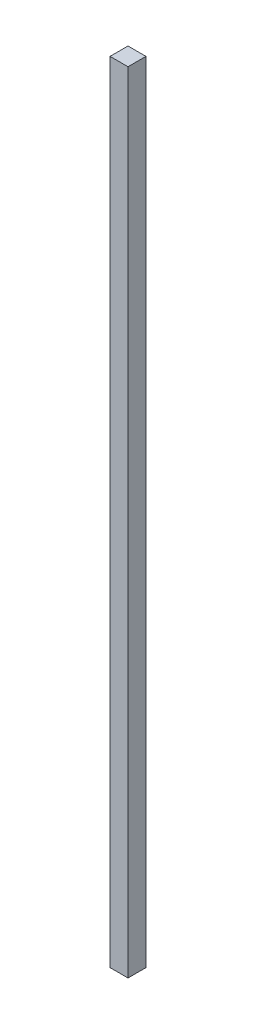
ISO-10303-21;
HEADER;
FILE_DESCRIPTION(('STEP AP214'),'2;1');
FILE_NAME('part.step','',(''),(''),'','','');
FILE_SCHEMA(('AUTOMOTIVE_DESIGN { 1 0 10303 214 1 1 1 1 }'));
ENDSEC;
DATA;
#1=APPLICATION_CONTEXT('core data for automotive mechanical design processes');
#2=APPLICATION_PROTOCOL_DEFINITION('international standard','automotive_design',2000,#1);
#3=PRODUCT_CONTEXT('',#1,'mechanical');
#4=PRODUCT('Part','Part','',(#3));
#5=PRODUCT_RELATED_PRODUCT_CATEGORY('part','',(#4));
#6=PRODUCT_DEFINITION_FORMATION('','',#4);
#7=PRODUCT_DEFINITION_CONTEXT('part definition',#1,'design');
#8=PRODUCT_DEFINITION('design','',#6,#7);
#9=PRODUCT_DEFINITION_SHAPE('','',#8);
#10=(LENGTH_UNIT() NAMED_UNIT(*) SI_UNIT(.MILLI.,.METRE.));
#11=(NAMED_UNIT(*) PLANE_ANGLE_UNIT() SI_UNIT($,.RADIAN.));
#12=(NAMED_UNIT(*) SI_UNIT($,.STERADIAN.) SOLID_ANGLE_UNIT());
#13=UNCERTAINTY_MEASURE_WITH_UNIT(LENGTH_MEASURE(1.E-05),#10,'distance_accuracy_value','');
#14=(GEOMETRIC_REPRESENTATION_CONTEXT(3) GLOBAL_UNCERTAINTY_ASSIGNED_CONTEXT((#13)) GLOBAL_UNIT_ASSIGNED_CONTEXT((#10,
#11,#12)) REPRESENTATION_CONTEXT('',''));
#15=CARTESIAN_POINT('',(0.,0.,0.));
#16=DIRECTION('',(0.,0.,1.));
#17=DIRECTION('',(1.,0.,0.));
#18=AXIS2_PLACEMENT_3D('',#15,#16,#17);
#19=CARTESIAN_POINT('',(0.,279.4,0.));
#20=DIRECTION('',(1.,0.,0.));
#21=DIRECTION('',(0.,0.,-1.));
#22=AXIS2_PLACEMENT_3D('',#19,#20,#21);
#23=PLANE('',#22);
#24=DIRECTION('',(0.,0.,1.));
#25=VECTOR('',#24,1.);
#26=CARTESIAN_POINT('',(0.,0.,0.));
#27=LINE('',#26,#25);
#28=CARTESIAN_POINT('',(0.,0.,0.));
#29=VERTEX_POINT('',#28);
#30=CARTESIAN_POINT('',(0.,0.,6.35));
#31=VERTEX_POINT('',#30);
#32=EDGE_CURVE('E96',#29,#31,#27,.T.);
#33=ORIENTED_EDGE('',*,*,#32,.T.);
#34=DIRECTION('',(0.,-1.,0.));
#35=VECTOR('',#34,1.);
#36=CARTESIAN_POINT('',(0.,279.4,6.35));
#37=LINE('',#36,#35);
#38=CARTESIAN_POINT('',(0.,279.4,6.35));
#39=VERTEX_POINT('',#38);
#40=EDGE_CURVE('E11',#39,#31,#37,.T.);
#41=ORIENTED_EDGE('',*,*,#40,.F.);
#42=DIRECTION('',(0.,0.,1.));
#43=VECTOR('',#42,1.);
#44=CARTESIAN_POINT('',(0.,279.4,0.));
#45=LINE('',#44,#43);
#46=CARTESIAN_POINT('',(0.,279.4,0.));
#47=VERTEX_POINT('',#46);
#48=EDGE_CURVE('E84',#47,#39,#45,.T.);
#49=ORIENTED_EDGE('',*,*,#48,.F.);
#50=DIRECTION('',(0.,-1.,0.));
#51=VECTOR('',#50,1.);
#52=CARTESIAN_POINT('',(0.,279.4,0.));
#53=LINE('',#52,#51);
#54=EDGE_CURVE('E92',#47,#29,#53,.T.);
#55=ORIENTED_EDGE('',*,*,#54,.T.);
#56=EDGE_LOOP('',(#33,#41,#49,#55));
#57=FACE_BOUND('',#56,.T.);
#58=ADVANCED_FACE('F33',(#57),#23,.F.);
#59=CARTESIAN_POINT('',(0.,279.4,6.35));
#60=DIRECTION('',(0.,0.,-1.));
#61=DIRECTION('',(-1.,0.,0.));
#62=AXIS2_PLACEMENT_3D('',#59,#60,#61);
#63=PLANE('',#62);
#64=DIRECTION('',(1.,0.,0.));
#65=VECTOR('',#64,1.);
#66=CARTESIAN_POINT('',(0.,0.,6.35));
#67=LINE('',#66,#65);
#68=CARTESIAN_POINT('',(6.35,0.,6.35));
#69=VERTEX_POINT('',#68);
#70=EDGE_CURVE('E88',#31,#69,#67,.T.);
#71=ORIENTED_EDGE('',*,*,#70,.T.);
#72=DIRECTION('',(0.,-1.,0.));
#73=VECTOR('',#72,1.);
#74=CARTESIAN_POINT('',(6.35,279.4,6.35));
#75=LINE('',#74,#73);
#76=CARTESIAN_POINT('',(6.35,279.4,6.35));
#77=VERTEX_POINT('',#76);
#78=EDGE_CURVE('E41',#77,#69,#75,.T.);
#79=ORIENTED_EDGE('',*,*,#78,.F.);
#80=DIRECTION('',(1.,0.,0.));
#81=VECTOR('',#80,1.);
#82=CARTESIAN_POINT('',(0.,279.4,6.35));
#83=LINE('',#82,#81);
#84=EDGE_CURVE('E79',#39,#77,#83,.T.);
#85=ORIENTED_EDGE('',*,*,#84,.F.);
#86=ORIENTED_EDGE('',*,*,#40,.T.);
#87=EDGE_LOOP('',(#71,#79,#85,#86));
#88=FACE_BOUND('',#87,.T.);
#89=ADVANCED_FACE('F87',(#88),#63,.F.);
#90=CARTESIAN_POINT('',(6.35,279.4,0.));
#91=DIRECTION('',(-1.,0.,0.));
#92=DIRECTION('',(0.,0.,1.));
#93=AXIS2_PLACEMENT_3D('',#90,#91,#92);
#94=PLANE('',#93);
#95=DIRECTION('',(0.,0.,-1.));
#96=VECTOR('',#95,1.);
#97=CARTESIAN_POINT('',(6.35,0.,0.));
#98=LINE('',#97,#96);
#99=CARTESIAN_POINT('',(6.35,0.,0.));
#100=VERTEX_POINT('',#99);
#101=EDGE_CURVE('E66',#69,#100,#98,.T.);
#102=ORIENTED_EDGE('',*,*,#101,.T.);
#103=DIRECTION('',(0.,-1.,0.));
#104=VECTOR('',#103,1.);
#105=CARTESIAN_POINT('',(6.35,279.4,0.));
#106=LINE('',#105,#104);
#107=CARTESIAN_POINT('',(6.35,279.4,0.));
#108=VERTEX_POINT('',#107);
#109=EDGE_CURVE('E89',#108,#100,#106,.T.);
#110=ORIENTED_EDGE('',*,*,#109,.F.);
#111=DIRECTION('',(0.,0.,-1.));
#112=VECTOR('',#111,1.);
#113=CARTESIAN_POINT('',(6.35,279.4,0.));
#114=LINE('',#113,#112);
#115=EDGE_CURVE('E82',#77,#108,#114,.T.);
#116=ORIENTED_EDGE('',*,*,#115,.F.);
#117=ORIENTED_EDGE('',*,*,#78,.T.);
#118=EDGE_LOOP('',(#102,#110,#116,#117));
#119=FACE_BOUND('',#118,.T.);
#120=ADVANCED_FACE('F90',(#119),#94,.F.);
#121=CARTESIAN_POINT('',(0.,279.4,0.));
#122=DIRECTION('',(0.,0.,1.));
#123=DIRECTION('',(1.,0.,0.));
#124=AXIS2_PLACEMENT_3D('',#121,#122,#123);
#125=PLANE('',#124);
#126=DIRECTION('',(-1.,0.,0.));
#127=VECTOR('',#126,1.);
#128=CARTESIAN_POINT('',(0.,0.,0.));
#129=LINE('',#128,#127);
#130=EDGE_CURVE('E72',#100,#29,#129,.T.);
#131=ORIENTED_EDGE('',*,*,#130,.T.);
#132=ORIENTED_EDGE('',*,*,#54,.F.);
#133=DIRECTION('',(-1.,0.,0.));
#134=VECTOR('',#133,1.);
#135=CARTESIAN_POINT('',(0.,279.4,0.));
#136=LINE('',#135,#134);
#137=EDGE_CURVE('E49',#108,#47,#136,.T.);
#138=ORIENTED_EDGE('',*,*,#137,.F.);
#139=ORIENTED_EDGE('',*,*,#109,.T.);
#140=EDGE_LOOP('',(#131,#132,#138,#139));
#141=FACE_BOUND('',#140,.T.);
#142=ADVANCED_FACE('F103',(#141),#125,.F.);
#143=CARTESIAN_POINT('',(0.,279.4,0.));
#144=DIRECTION('',(0.,1.,0.));
#145=DIRECTION('',(0.,0.,1.));
#146=AXIS2_PLACEMENT_3D('',#143,#144,#145);
#147=PLANE('',#146);
#148=ORIENTED_EDGE('',*,*,#48,.T.);
#149=ORIENTED_EDGE('',*,*,#84,.T.);
#150=ORIENTED_EDGE('',*,*,#115,.T.);
#151=ORIENTED_EDGE('',*,*,#137,.T.);
#152=EDGE_LOOP('',(#148,#149,#150,#151));
#153=FACE_BOUND('',#152,.T.);
#154=ADVANCED_FACE('F80',(#153),#147,.T.);
#155=CARTESIAN_POINT('',(0.,0.,0.));
#156=DIRECTION('',(0.,1.,0.));
#157=DIRECTION('',(0.,0.,1.));
#158=AXIS2_PLACEMENT_3D('',#155,#156,#157);
#159=PLANE('',#158);
#160=ORIENTED_EDGE('',*,*,#32,.F.);
#161=ORIENTED_EDGE('',*,*,#130,.F.);
#162=ORIENTED_EDGE('',*,*,#101,.F.);
#163=ORIENTED_EDGE('',*,*,#70,.F.);
#164=EDGE_LOOP('',(#160,#161,#162,#163));
#165=FACE_BOUND('',#164,.T.);
#166=ADVANCED_FACE('F106',(#165),#159,.F.);
#167=CLOSED_SHELL('',(#58,#89,#120,#142,#154,#166));
#168=MANIFOLD_SOLID_BREP('B2',#167);
#169=ADVANCED_BREP_SHAPE_REPRESENTATION('',(#18,#168),#14);
#170=SHAPE_DEFINITION_REPRESENTATION(#9,#169);
ENDSEC;
END-ISO-10303-21;
